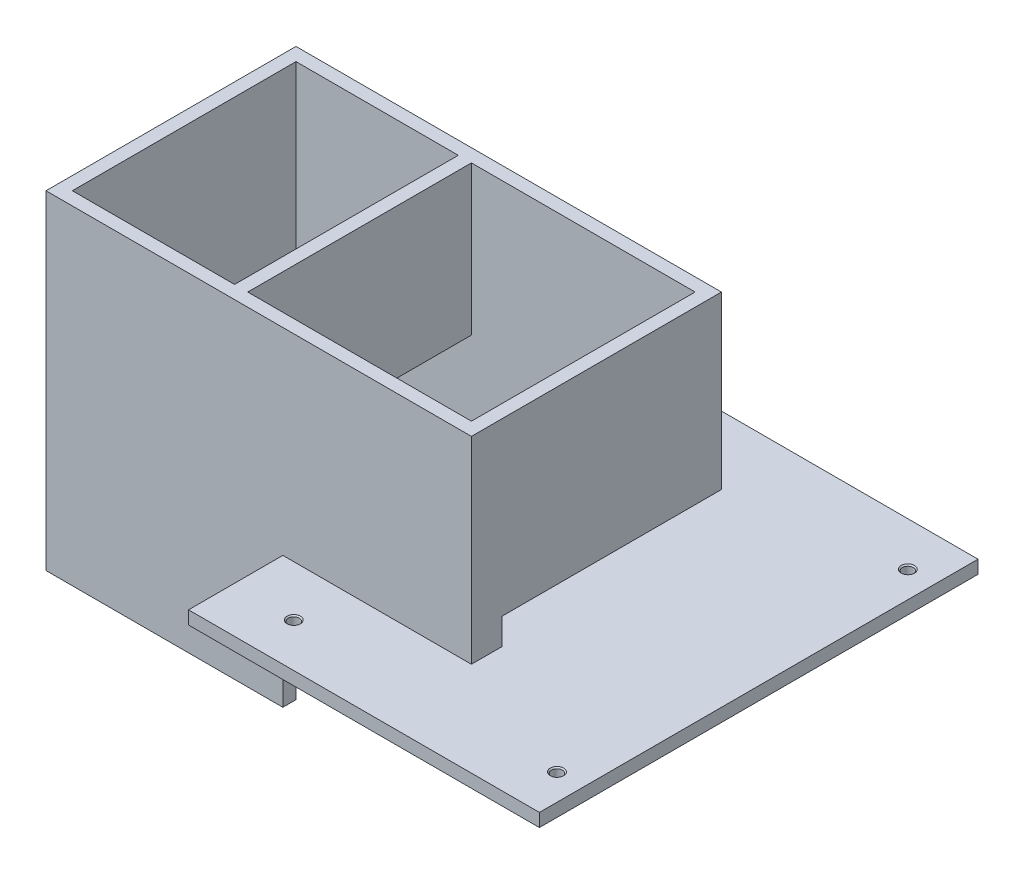
ISO-10303-21;
HEADER;
FILE_DESCRIPTION(('STEP AP214'),'2;1');
FILE_NAME('part.step','',(''),(''),'','','');
FILE_SCHEMA(('AUTOMOTIVE_DESIGN { 1 0 10303 214 1 1 1 1 }'));
ENDSEC;
DATA;
#1=APPLICATION_CONTEXT('core data for automotive mechanical design processes');
#2=APPLICATION_PROTOCOL_DEFINITION('international standard','automotive_design',2000,#1);
#3=PRODUCT_CONTEXT('',#1,'mechanical');
#4=PRODUCT('Part','Part','',(#3));
#5=PRODUCT_RELATED_PRODUCT_CATEGORY('part','',(#4));
#6=PRODUCT_DEFINITION_FORMATION('','',#4);
#7=PRODUCT_DEFINITION_CONTEXT('part definition',#1,'design');
#8=PRODUCT_DEFINITION('design','',#6,#7);
#9=PRODUCT_DEFINITION_SHAPE('','',#8);
#10=(LENGTH_UNIT() NAMED_UNIT(*) SI_UNIT(.MILLI.,.METRE.));
#11=(NAMED_UNIT(*) PLANE_ANGLE_UNIT() SI_UNIT($,.RADIAN.));
#12=(NAMED_UNIT(*) SI_UNIT($,.STERADIAN.) SOLID_ANGLE_UNIT());
#13=UNCERTAINTY_MEASURE_WITH_UNIT(LENGTH_MEASURE(1.E-05),#10,'distance_accuracy_value','');
#14=(GEOMETRIC_REPRESENTATION_CONTEXT(3) GLOBAL_UNCERTAINTY_ASSIGNED_CONTEXT((#13)) GLOBAL_UNIT_ASSIGNED_CONTEXT((#10,
#11,#12)) REPRESENTATION_CONTEXT('',''));
#15=CARTESIAN_POINT('',(0.,0.,0.));
#16=DIRECTION('',(0.,0.,1.));
#17=DIRECTION('',(1.,0.,0.));
#18=AXIS2_PLACEMENT_3D('',#15,#16,#17);
#19=CARTESIAN_POINT('',(-60.7657345094222,3.,-28.3375572312174));
#20=DIRECTION('',(1.,0.,0.));
#21=DIRECTION('',(0.,0.,-1.));
#22=AXIS2_PLACEMENT_3D('',#19,#20,#21);
#23=PLANE('',#22);
#24=DIRECTION('',(0.,0.,-1.));
#25=VECTOR('',#24,1.);
#26=CARTESIAN_POINT('',(-60.7657345094222,0.,50.1624427687826));
#27=LINE('',#26,#25);
#28=CARTESIAN_POINT('',(-60.7657345094222,0.,47.1624427687826));
#29=VERTEX_POINT('',#28);
#30=CARTESIAN_POINT('',(-60.7657345094222,0.,-3.83755723121743));
#31=VERTEX_POINT('',#30);
#32=EDGE_CURVE('E226',#29,#31,#27,.T.);
#33=ORIENTED_EDGE('',*,*,#32,.F.);
#34=DIRECTION('',(0.,1.,0.));
#35=VECTOR('',#34,1.);
#36=CARTESIAN_POINT('',(-60.7657345094222,-27.,47.1624427687826));
#37=LINE('',#36,#35);
#38=CARTESIAN_POINT('',(-60.7657345094222,3.,47.1624427687826));
#39=VERTEX_POINT('',#38);
#40=EDGE_CURVE('E342',#29,#39,#37,.T.);
#41=ORIENTED_EDGE('',*,*,#40,.T.);
#42=DIRECTION('',(0.,0.,1.));
#43=VECTOR('',#42,1.);
#44=CARTESIAN_POINT('',(-60.7657345094222,3.,-28.3375572312174));
#45=LINE('',#44,#43);
#46=CARTESIAN_POINT('',(-60.7657345094222,3.,-3.83755723121744));
#47=VERTEX_POINT('',#46);
#48=EDGE_CURVE('E514',#47,#39,#45,.T.);
#49=ORIENTED_EDGE('',*,*,#48,.F.);
#50=DIRECTION('',(0.,1.,0.));
#51=VECTOR('',#50,1.);
#52=CARTESIAN_POINT('',(-60.7657345094222,-27.,-3.83755723121744));
#53=LINE('',#52,#51);
#54=EDGE_CURVE('E346',#31,#47,#53,.T.);
#55=ORIENTED_EDGE('',*,*,#54,.F.);
#56=EDGE_LOOP('',(#33,#41,#49,#55));
#57=FACE_BOUND('',#56,.T.);
#58=ADVANCED_FACE('F40',(#57),#23,.F.);
#59=DIRECTION('',(0.,1.,0.));
#60=VECTOR('',#59,1.);
#61=CARTESIAN_POINT('',(-60.7657345094222,3.,50.1624427687826));
#62=LINE('',#61,#60);
#63=CARTESIAN_POINT('',(-60.7657345094222,0.,50.1624427687826));
#64=VERTEX_POINT('',#63);
#65=CARTESIAN_POINT('',(-60.7657345094223,3.,50.1624427687826));
#66=VERTEX_POINT('',#65);
#67=EDGE_CURVE('E255',#64,#66,#62,.T.);
#68=ORIENTED_EDGE('',*,*,#67,.F.);
#69=DIRECTION('',(0.,0.,1.));
#70=VECTOR('',#69,1.);
#71=CARTESIAN_POINT('',(-60.7657345094222,0.,-28.3375572312174));
#72=LINE('',#71,#70);
#73=CARTESIAN_POINT('',(-60.7657345094222,0.,71.6624427687826));
#74=VERTEX_POINT('',#73);
#75=EDGE_CURVE('E262',#64,#74,#72,.T.);
#76=ORIENTED_EDGE('',*,*,#75,.T.);
#77=DIRECTION('',(0.,-1.,0.));
#78=VECTOR('',#77,1.);
#79=CARTESIAN_POINT('',(-60.7657345094222,3.,71.6624427687826));
#80=LINE('',#79,#78);
#81=CARTESIAN_POINT('',(-60.7657345094222,3.,71.6624427687826));
#82=VERTEX_POINT('',#81);
#83=EDGE_CURVE('E276',#82,#74,#80,.T.);
#84=ORIENTED_EDGE('',*,*,#83,.F.);
#85=EDGE_CURVE('E511',#66,#82,#45,.T.);
#86=ORIENTED_EDGE('',*,*,#85,.F.);
#87=EDGE_LOOP('',(#68,#76,#84,#86));
#88=FACE_BOUND('',#87,.T.);
#89=ADVANCED_FACE('F531',(#88),#23,.F.);
#90=DIRECTION('',(0.,-1.,0.));
#91=VECTOR('',#90,1.);
#92=CARTESIAN_POINT('',(-60.7657345094222,3.,-6.83755723121744));
#93=LINE('',#92,#91);
#94=CARTESIAN_POINT('',(-60.7657345094223,3.,-6.83755723121744));
#95=VERTEX_POINT('',#94);
#96=CARTESIAN_POINT('',(-60.7657345094222,0.,-6.83755723121744));
#97=VERTEX_POINT('',#96);
#98=EDGE_CURVE('E246',#95,#97,#93,.T.);
#99=ORIENTED_EDGE('',*,*,#98,.F.);
#100=CARTESIAN_POINT('',(-60.7657345094222,3.,-28.3375572312174));
#101=VERTEX_POINT('',#100);
#102=EDGE_CURVE('E286',#101,#95,#45,.T.);
#103=ORIENTED_EDGE('',*,*,#102,.F.);
#104=DIRECTION('',(0.,-1.,0.));
#105=VECTOR('',#104,1.);
#106=CARTESIAN_POINT('',(-60.7657345094222,3.,-28.3375572312174));
#107=LINE('',#106,#105);
#108=CARTESIAN_POINT('',(-60.7657345094222,0.,-28.3375572312174));
#109=VERTEX_POINT('',#108);
#110=EDGE_CURVE('E259',#101,#109,#107,.T.);
#111=ORIENTED_EDGE('',*,*,#110,.T.);
#112=EDGE_CURVE('E222',#109,#97,#72,.T.);
#113=ORIENTED_EDGE('',*,*,#112,.T.);
#114=EDGE_LOOP('',(#99,#103,#111,#113));
#115=FACE_BOUND('',#114,.T.);
#116=ADVANCED_FACE('F258',(#115),#23,.F.);
#117=CARTESIAN_POINT('',(0.,0.,0.));
#118=DIRECTION('',(0.,-1.,0.));
#119=DIRECTION('',(0.,0.,-1.));
#120=AXIS2_PLACEMENT_3D('',#117,#118,#119);
#121=PLANE('',#120);
#122=EDGE_CURVE('E216',#31,#97,#27,.T.);
#123=ORIENTED_EDGE('',*,*,#122,.T.);
#124=ORIENTED_EDGE('',*,*,#112,.F.);
#125=DIRECTION('',(1.,0.,0.));
#126=VECTOR('',#125,1.);
#127=CARTESIAN_POINT('',(-60.7657345094222,0.,-28.3375572312174));
#128=LINE('',#127,#126);
#129=CARTESIAN_POINT('',(19.2342654905778,0.,-28.3375572312174));
#130=VERTEX_POINT('',#129);
#131=EDGE_CURVE('E503',#109,#130,#128,.T.);
#132=ORIENTED_EDGE('',*,*,#131,.T.);
#133=DIRECTION('',(0.,0.,1.));
#134=VECTOR('',#133,1.);
#135=CARTESIAN_POINT('',(19.2342654905778,0.,-28.3375572312174));
#136=LINE('',#135,#134);
#137=CARTESIAN_POINT('',(19.2342654905778,0.,71.6624427687826));
#138=VERTEX_POINT('',#137);
#139=EDGE_CURVE('E516',#130,#138,#136,.T.);
#140=ORIENTED_EDGE('',*,*,#139,.T.);
#141=DIRECTION('',(1.,0.,0.));
#142=VECTOR('',#141,1.);
#143=CARTESIAN_POINT('',(-60.7657345094222,0.,71.6624427687826));
#144=LINE('',#143,#142);
#145=EDGE_CURVE('E269',#74,#138,#144,.T.);
#146=ORIENTED_EDGE('',*,*,#145,.F.);
#147=ORIENTED_EDGE('',*,*,#75,.F.);
#148=EDGE_CURVE('E232',#64,#29,#27,.T.);
#149=ORIENTED_EDGE('',*,*,#148,.T.);
#150=ORIENTED_EDGE('',*,*,#32,.T.);
#151=EDGE_LOOP('',(#123,#124,#132,#140,#146,#147,#149,#150));
#152=FACE_BOUND('',#151,.T.);
#153=CARTESIAN_POINT('',(-46.7657345094222,0.,-18.3375572312174));
#154=DIRECTION('',(0.,-1.,0.));
#155=DIRECTION('',(0.,0.,-1.));
#156=AXIS2_PLACEMENT_3D('',#153,#154,#155);
#157=CIRCLE('',#156,1.24999999999999);
#158=CARTESIAN_POINT('',(-46.7657345094222,0.,-19.5875572312174));
#159=VERTEX_POINT('',#158);
#160=EDGE_CURVE('E44',#159,#159,#157,.T.);
#161=ORIENTED_EDGE('',*,*,#160,.F.);
#162=EDGE_LOOP('',(#161));
#163=FACE_BOUND('',#162,.T.);
#164=CARTESIAN_POINT('',(13.2342654905778,0.,-18.3375572312174));
#165=DIRECTION('',(0.,-1.,0.));
#166=DIRECTION('',(0.,0.,-1.));
#167=AXIS2_PLACEMENT_3D('',#164,#165,#166);
#168=CIRCLE('',#167,1.25);
#169=CARTESIAN_POINT('',(13.2342654905778,0.,-19.5875572312174));
#170=VERTEX_POINT('',#169);
#171=EDGE_CURVE('E301',#170,#170,#168,.T.);
#172=ORIENTED_EDGE('',*,*,#171,.F.);
#173=EDGE_LOOP('',(#172));
#174=FACE_BOUND('',#173,.T.);
#175=CARTESIAN_POINT('',(13.2342654905778,0.,61.6624427687825));
#176=DIRECTION('',(0.,-1.,0.));
#177=DIRECTION('',(0.,0.,-1.));
#178=AXIS2_PLACEMENT_3D('',#175,#176,#177);
#179=CIRCLE('',#178,1.25);
#180=CARTESIAN_POINT('',(13.2342654905778,0.,60.4124427687826));
#181=VERTEX_POINT('',#180);
#182=EDGE_CURVE('E296',#181,#181,#179,.T.);
#183=ORIENTED_EDGE('',*,*,#182,.F.);
#184=EDGE_LOOP('',(#183));
#185=FACE_BOUND('',#184,.T.);
#186=CARTESIAN_POINT('',(-46.7657345094222,0.,61.6624427687825));
#187=DIRECTION('',(0.,-1.,0.));
#188=DIRECTION('',(0.,0.,-1.));
#189=AXIS2_PLACEMENT_3D('',#186,#187,#188);
#190=CIRCLE('',#189,1.24999999999999);
#191=CARTESIAN_POINT('',(-46.7657345094222,0.,60.4124427687826));
#192=VERTEX_POINT('',#191);
#193=EDGE_CURVE('E290',#192,#192,#190,.T.);
#194=ORIENTED_EDGE('',*,*,#193,.F.);
#195=EDGE_LOOP('',(#194));
#196=FACE_BOUND('',#195,.T.);
#197=ADVANCED_FACE('F218',(#152,#163,#174,#185,#196),#121,.T.);
#198=CARTESIAN_POINT('',(-111.765734509422,48.,47.1624427687826));
#199=DIRECTION('',(0.,0.,-1.));
#200=DIRECTION('',(-1.,0.,0.));
#201=AXIS2_PLACEMENT_3D('',#198,#199,#200);
#202=PLANE('',#201);
#203=DIRECTION('',(1.,0.,0.));
#204=VECTOR('',#203,1.);
#205=CARTESIAN_POINT('',(-111.765734509422,48.,47.1624427687826));
#206=LINE('',#205,#204);
#207=CARTESIAN_POINT('',(-111.765734509422,48.,47.1624427687826));
#208=VERTEX_POINT('',#207);
#209=CARTESIAN_POINT('',(-74.7657345094222,48.,47.1624427687826));
#210=VERTEX_POINT('',#209);
#211=EDGE_CURVE('E433',#208,#210,#206,.T.);
#212=ORIENTED_EDGE('',*,*,#211,.T.);
#213=DIRECTION('',(0.,-1.,0.));
#214=VECTOR('',#213,1.);
#215=CARTESIAN_POINT('',(-74.7657345094222,48.,47.1624427687826));
#216=LINE('',#215,#214);
#217=CARTESIAN_POINT('',(-74.7657345094222,14.,47.1624427687826));
#218=VERTEX_POINT('',#217);
#219=EDGE_CURVE('E392',#210,#218,#216,.T.);
#220=ORIENTED_EDGE('',*,*,#219,.T.);
#221=DIRECTION('',(1.,0.,0.));
#222=VECTOR('',#221,1.);
#223=CARTESIAN_POINT('',(-74.7657345094222,14.,47.1624427687826));
#224=LINE('',#223,#222);
#225=CARTESIAN_POINT('',(-71.7657345094222,14.,47.1624427687826));
#226=VERTEX_POINT('',#225);
#227=EDGE_CURVE('E396',#218,#226,#224,.T.);
#228=ORIENTED_EDGE('',*,*,#227,.T.);
#229=DIRECTION('',(0.,1.,0.));
#230=VECTOR('',#229,1.);
#231=CARTESIAN_POINT('',(-71.7657345094222,14.,47.1624427687826));
#232=LINE('',#231,#230);
#233=CARTESIAN_POINT('',(-71.7657345094222,48.,47.1624427687826));
#234=VERTEX_POINT('',#233);
#235=EDGE_CURVE('E401',#226,#234,#232,.T.);
#236=ORIENTED_EDGE('',*,*,#235,.T.);
#237=CARTESIAN_POINT('',(-20.7657345094222,48.,47.1624427687826));
#238=VERTEX_POINT('',#237);
#239=EDGE_CURVE('E431',#234,#238,#206,.T.);
#240=ORIENTED_EDGE('',*,*,#239,.T.);
#241=DIRECTION('',(0.,-1.,0.));
#242=VECTOR('',#241,1.);
#243=CARTESIAN_POINT('',(-20.7657345094222,48.,47.1624427687826));
#244=LINE('',#243,#242);
#245=CARTESIAN_POINT('',(-20.7657345094222,3.,47.1624427687826));
#246=VERTEX_POINT('',#245);
#247=EDGE_CURVE('E461',#238,#246,#244,.T.);
#248=ORIENTED_EDGE('',*,*,#247,.T.);
#249=DIRECTION('',(1.,0.,0.));
#250=VECTOR('',#249,1.);
#251=CARTESIAN_POINT('',(-111.765734509422,3.,47.1624427687826));
#252=LINE('',#251,#250);
#253=EDGE_CURVE('E275',#39,#246,#252,.T.);
#254=ORIENTED_EDGE('',*,*,#253,.F.);
#255=ORIENTED_EDGE('',*,*,#40,.F.);
#256=CARTESIAN_POINT('',(-60.7657345094222,-27.,47.1624427687826));
#257=VERTEX_POINT('',#256);
#258=EDGE_CURVE('E343',#257,#29,#37,.T.);
#259=ORIENTED_EDGE('',*,*,#258,.F.);
#260=DIRECTION('',(-1.,0.,0.));
#261=VECTOR('',#260,1.);
#262=CARTESIAN_POINT('',(-60.7657345094222,-27.,47.1624427687826));
#263=LINE('',#262,#261);
#264=CARTESIAN_POINT('',(-111.765734509422,-27.,47.1624427687826));
#265=VERTEX_POINT('',#264);
#266=EDGE_CURVE('E294',#257,#265,#263,.T.);
#267=ORIENTED_EDGE('',*,*,#266,.T.);
#268=DIRECTION('',(0.,-1.,0.));
#269=VECTOR('',#268,1.);
#270=CARTESIAN_POINT('',(-111.765734509422,48.,47.1624427687826));
#271=LINE('',#270,#269);
#272=EDGE_CURVE('E465',#208,#265,#271,.T.);
#273=ORIENTED_EDGE('',*,*,#272,.F.);
#274=EDGE_LOOP('',(#212,#220,#228,#236,#240,#248,#254,#255,#259,#267,#273));
#275=FACE_BOUND('',#274,.T.);
#276=ADVANCED_FACE('F580',(#275),#202,.T.);
#277=CARTESIAN_POINT('',(-111.765734509422,48.,-3.83755723121744));
#278=DIRECTION('',(0.,0.,1.));
#279=DIRECTION('',(1.,0.,0.));
#280=AXIS2_PLACEMENT_3D('',#277,#278,#279);
#281=PLANE('',#280);
#282=DIRECTION('',(-1.,0.,0.));
#283=VECTOR('',#282,1.);
#284=CARTESIAN_POINT('',(-111.765734509422,9.00000000000002,-3.83755723121744));
#285=LINE('',#284,#283);
#286=CARTESIAN_POINT('',(-20.7657345094222,9.00000000000001,-3.83755723121744));
#287=VERTEX_POINT('',#286);
#288=CARTESIAN_POINT('',(-47.7657345094222,9.00000000000001,-3.83755723121744));
#289=VERTEX_POINT('',#288);
#290=EDGE_CURVE('E380',#287,#289,#285,.T.);
#291=ORIENTED_EDGE('',*,*,#290,.F.);
#292=DIRECTION('',(0.,-1.,0.));
#293=VECTOR('',#292,1.);
#294=CARTESIAN_POINT('',(-20.7657345094222,48.,-3.83755723121744));
#295=LINE('',#294,#293);
#296=CARTESIAN_POINT('',(-20.7657345094222,48.,-3.83755723121744));
#297=VERTEX_POINT('',#296);
#298=EDGE_CURVE('E457',#297,#287,#295,.T.);
#299=ORIENTED_EDGE('',*,*,#298,.F.);
#300=DIRECTION('',(-1.,0.,0.));
#301=VECTOR('',#300,1.);
#302=CARTESIAN_POINT('',(-111.765734509422,48.,-3.83755723121744));
#303=LINE('',#302,#301);
#304=CARTESIAN_POINT('',(-71.7657345094222,48.,-3.83755723121744));
#305=VERTEX_POINT('',#304);
#306=EDGE_CURVE('E442',#297,#305,#303,.T.);
#307=ORIENTED_EDGE('',*,*,#306,.T.);
#308=DIRECTION('',(0.,1.,0.));
#309=VECTOR('',#308,1.);
#310=CARTESIAN_POINT('',(-71.7657345094222,14.,-3.83755723121744));
#311=LINE('',#310,#309);
#312=CARTESIAN_POINT('',(-71.7657345094222,14.,-3.83755723121744));
#313=VERTEX_POINT('',#312);
#314=EDGE_CURVE('E397',#313,#305,#311,.T.);
#315=ORIENTED_EDGE('',*,*,#314,.F.);
#316=DIRECTION('',(1.,0.,0.));
#317=VECTOR('',#316,1.);
#318=CARTESIAN_POINT('',(-74.7657345094222,14.,-3.83755723121744));
#319=LINE('',#318,#317);
#320=CARTESIAN_POINT('',(-74.7657345094222,14.,-3.83755723121744));
#321=VERTEX_POINT('',#320);
#322=EDGE_CURVE('E408',#321,#313,#319,.T.);
#323=ORIENTED_EDGE('',*,*,#322,.F.);
#324=DIRECTION('',(0.,-1.,0.));
#325=VECTOR('',#324,1.);
#326=CARTESIAN_POINT('',(-74.7657345094222,48.,-3.83755723121744));
#327=LINE('',#326,#325);
#328=CARTESIAN_POINT('',(-74.7657345094222,48.,-3.83755723121744));
#329=VERTEX_POINT('',#328);
#330=EDGE_CURVE('E391',#329,#321,#327,.T.);
#331=ORIENTED_EDGE('',*,*,#330,.F.);
#332=CARTESIAN_POINT('',(-111.765734509422,48.,-3.83755723121744));
#333=VERTEX_POINT('',#332);
#334=EDGE_CURVE('E441',#329,#333,#303,.T.);
#335=ORIENTED_EDGE('',*,*,#334,.T.);
#336=DIRECTION('',(0.,-1.,0.));
#337=VECTOR('',#336,1.);
#338=CARTESIAN_POINT('',(-111.765734509422,48.,-3.83755723121744));
#339=LINE('',#338,#337);
#340=CARTESIAN_POINT('',(-111.765734509422,-27.,-3.83755723121744));
#341=VERTEX_POINT('',#340);
#342=EDGE_CURVE('E446',#333,#341,#339,.T.);
#343=ORIENTED_EDGE('',*,*,#342,.T.);
#344=DIRECTION('',(1.,0.,0.));
#345=VECTOR('',#344,1.);
#346=CARTESIAN_POINT('',(-111.765734509422,-27.,-3.83755723121744));
#347=LINE('',#346,#345);
#348=CARTESIAN_POINT('',(-60.7657345094222,-27.,-3.83755723121743));
#349=VERTEX_POINT('',#348);
#350=EDGE_CURVE('E338',#341,#349,#347,.T.);
#351=ORIENTED_EDGE('',*,*,#350,.T.);
#352=EDGE_CURVE('E347',#349,#31,#53,.T.);
#353=ORIENTED_EDGE('',*,*,#352,.T.);
#354=ORIENTED_EDGE('',*,*,#54,.T.);
#355=DIRECTION('',(-1.,0.,0.));
#356=VECTOR('',#355,1.);
#357=CARTESIAN_POINT('',(-111.765734509422,3.,-3.83755723121744));
#358=LINE('',#357,#356);
#359=CARTESIAN_POINT('',(-47.7657345094222,3.,-3.83755723121744));
#360=VERTEX_POINT('',#359);
#361=EDGE_CURVE('E432',#360,#47,#358,.T.);
#362=ORIENTED_EDGE('',*,*,#361,.F.);
#363=DIRECTION('',(0.,-1.,0.));
#364=VECTOR('',#363,1.);
#365=CARTESIAN_POINT('',(-47.7657345094222,48.,-3.83755723121744));
#366=LINE('',#365,#364);
#367=EDGE_CURVE('E388',#289,#360,#366,.T.);
#368=ORIENTED_EDGE('',*,*,#367,.F.);
#369=EDGE_LOOP('',(#291,#299,#307,#315,#323,#331,#335,#343,#351,#353,#354,#362,#368));
#370=FACE_BOUND('',#369,.T.);
#371=ADVANCED_FACE('F572',(#370),#281,.T.);
#372=CARTESIAN_POINT('',(-60.7657345094222,3.,-28.3375572312174));
#373=DIRECTION('',(0.,0.,-1.));
#374=DIRECTION('',(-1.,0.,0.));
#375=AXIS2_PLACEMENT_3D('',#372,#373,#374);
#376=PLANE('',#375);
#377=ORIENTED_EDGE('',*,*,#131,.F.);
#378=ORIENTED_EDGE('',*,*,#110,.F.);
#379=DIRECTION('',(1.,0.,0.));
#380=VECTOR('',#379,1.);
#381=CARTESIAN_POINT('',(-60.7657345094222,3.,-28.3375572312174));
#382=LINE('',#381,#380);
#383=CARTESIAN_POINT('',(19.2342654905778,3.,-28.3375572312174));
#384=VERTEX_POINT('',#383);
#385=EDGE_CURVE('E261',#101,#384,#382,.T.);
#386=ORIENTED_EDGE('',*,*,#385,.T.);
#387=DIRECTION('',(0.,-1.,0.));
#388=VECTOR('',#387,1.);
#389=CARTESIAN_POINT('',(19.2342654905778,3.,-28.3375572312174));
#390=LINE('',#389,#388);
#391=EDGE_CURVE('E283',#384,#130,#390,.T.);
#392=ORIENTED_EDGE('',*,*,#391,.T.);
#393=EDGE_LOOP('',(#377,#378,#386,#392));
#394=FACE_BOUND('',#393,.T.);
#395=ADVANCED_FACE('F42',(#394),#376,.T.);
#396=CARTESIAN_POINT('',(-60.7657345094222,3.,71.6624427687826));
#397=DIRECTION('',(0.,0.,-1.));
#398=DIRECTION('',(-1.,0.,0.));
#399=AXIS2_PLACEMENT_3D('',#396,#397,#398);
#400=PLANE('',#399);
#401=ORIENTED_EDGE('',*,*,#145,.T.);
#402=DIRECTION('',(0.,-1.,0.));
#403=VECTOR('',#402,1.);
#404=CARTESIAN_POINT('',(19.2342654905778,3.,71.6624427687826));
#405=LINE('',#404,#403);
#406=CARTESIAN_POINT('',(19.2342654905778,3.,71.6624427687826));
#407=VERTEX_POINT('',#406);
#408=EDGE_CURVE('E280',#407,#138,#405,.T.);
#409=ORIENTED_EDGE('',*,*,#408,.F.);
#410=DIRECTION('',(1.,0.,0.));
#411=VECTOR('',#410,1.);
#412=CARTESIAN_POINT('',(-60.7657345094222,3.,71.6624427687826));
#413=LINE('',#412,#411);
#414=EDGE_CURVE('E508',#82,#407,#413,.T.);
#415=ORIENTED_EDGE('',*,*,#414,.F.);
#416=ORIENTED_EDGE('',*,*,#83,.T.);
#417=EDGE_LOOP('',(#401,#409,#415,#416));
#418=FACE_BOUND('',#417,.T.);
#419=ADVANCED_FACE('F525',(#418),#400,.F.);
#420=CARTESIAN_POINT('',(19.2342654905778,3.,-28.3375572312174));
#421=DIRECTION('',(1.,0.,0.));
#422=DIRECTION('',(0.,0.,-1.));
#423=AXIS2_PLACEMENT_3D('',#420,#421,#422);
#424=PLANE('',#423);
#425=ORIENTED_EDGE('',*,*,#139,.F.);
#426=ORIENTED_EDGE('',*,*,#391,.F.);
#427=DIRECTION('',(0.,0.,1.));
#428=VECTOR('',#427,1.);
#429=CARTESIAN_POINT('',(19.2342654905778,3.,-28.3375572312174));
#430=LINE('',#429,#428);
#431=EDGE_CURVE('E267',#384,#407,#430,.T.);
#432=ORIENTED_EDGE('',*,*,#431,.T.);
#433=ORIENTED_EDGE('',*,*,#408,.T.);
#434=EDGE_LOOP('',(#425,#426,#432,#433));
#435=FACE_BOUND('',#434,.T.);
#436=ADVANCED_FACE('F658',(#435),#424,.T.);
#437=CARTESIAN_POINT('',(0.,3.,0.));
#438=DIRECTION('',(0.,-1.,0.));
#439=DIRECTION('',(0.,0.,-1.));
#440=AXIS2_PLACEMENT_3D('',#437,#438,#439);
#441=PLANE('',#440);
#442=CARTESIAN_POINT('',(-46.7657345094222,3.,-18.3375572312174));
#443=DIRECTION('',(0.,1.,0.));
#444=DIRECTION('',(0.,0.,1.));
#445=AXIS2_PLACEMENT_3D('',#442,#443,#444);
#446=CIRCLE('',#445,1.525);
#447=CARTESIAN_POINT('',(-46.7657345094222,3.,-16.8125572312174));
#448=VERTEX_POINT('',#447);
#449=EDGE_CURVE('E622',#448,#448,#446,.T.);
#450=ORIENTED_EDGE('',*,*,#449,.F.);
#451=EDGE_LOOP('',(#450));
#452=FACE_BOUND('',#451,.T.);
#453=CARTESIAN_POINT('',(13.2342654905778,3.,-18.3375572312174));
#454=DIRECTION('',(0.,1.,0.));
#455=DIRECTION('',(0.,0.,1.));
#456=AXIS2_PLACEMENT_3D('',#453,#454,#455);
#457=CIRCLE('',#456,1.525);
#458=CARTESIAN_POINT('',(13.2342654905778,3.,-16.8125572312174));
#459=VERTEX_POINT('',#458);
#460=EDGE_CURVE('E313',#459,#459,#457,.T.);
#461=ORIENTED_EDGE('',*,*,#460,.F.);
#462=EDGE_LOOP('',(#461));
#463=FACE_BOUND('',#462,.T.);
#464=CARTESIAN_POINT('',(13.2342654905778,3.,61.6624427687825));
#465=DIRECTION('',(0.,1.,0.));
#466=DIRECTION('',(0.,0.,1.));
#467=AXIS2_PLACEMENT_3D('',#464,#465,#466);
#468=CIRCLE('',#467,1.525);
#469=CARTESIAN_POINT('',(13.2342654905778,3.,63.1874427687825));
#470=VERTEX_POINT('',#469);
#471=EDGE_CURVE('E304',#470,#470,#468,.T.);
#472=ORIENTED_EDGE('',*,*,#471,.F.);
#473=EDGE_LOOP('',(#472));
#474=FACE_BOUND('',#473,.T.);
#475=CARTESIAN_POINT('',(-46.7657345094222,3.,61.6624427687825));
#476=DIRECTION('',(0.,1.,0.));
#477=DIRECTION('',(0.,0.,1.));
#478=AXIS2_PLACEMENT_3D('',#475,#476,#477);
#479=CIRCLE('',#478,1.525);
#480=CARTESIAN_POINT('',(-46.7657345094222,3.,63.1874427687825));
#481=VERTEX_POINT('',#480);
#482=EDGE_CURVE('E299',#481,#481,#479,.T.);
#483=ORIENTED_EDGE('',*,*,#482,.F.);
#484=EDGE_LOOP('',(#483));
#485=FACE_BOUND('',#484,.T.);
#486=ORIENTED_EDGE('',*,*,#253,.T.);
#487=DIRECTION('',(0.,0.,-1.));
#488=VECTOR('',#487,1.);
#489=CARTESIAN_POINT('',(-20.7657345094222,3.,-3.83755723121744));
#490=LINE('',#489,#488);
#491=CARTESIAN_POINT('',(-20.7657345094222,3.,43.1624427687826));
#492=VERTEX_POINT('',#491);
#493=EDGE_CURVE('E427',#246,#492,#490,.T.);
#494=ORIENTED_EDGE('',*,*,#493,.T.);
#495=DIRECTION('',(-1.,0.,0.));
#496=VECTOR('',#495,1.);
#497=CARTESIAN_POINT('',(-17.7657345094222,3.,43.1624427687826));
#498=LINE('',#497,#496);
#499=CARTESIAN_POINT('',(-17.7657345094222,3.,43.1624427687826));
#500=VERTEX_POINT('',#499);
#501=EDGE_CURVE('E66',#500,#492,#498,.T.);
#502=ORIENTED_EDGE('',*,*,#501,.F.);
#503=DIRECTION('',(0.,0.,-1.));
#504=VECTOR('',#503,1.);
#505=CARTESIAN_POINT('',(-17.7657345094222,3.,-6.83755723121744));
#506=LINE('',#505,#504);
#507=CARTESIAN_POINT('',(-17.7657345094222,3.,50.1624427687826));
#508=VERTEX_POINT('',#507);
#509=EDGE_CURVE('E473',#508,#500,#506,.T.);
#510=ORIENTED_EDGE('',*,*,#509,.F.);
#511=DIRECTION('',(1.,0.,0.));
#512=VECTOR('',#511,1.);
#513=CARTESIAN_POINT('',(-114.765734509422,3.,50.1624427687826));
#514=LINE('',#513,#512);
#515=EDGE_CURVE('E288',#66,#508,#514,.T.);
#516=ORIENTED_EDGE('',*,*,#515,.F.);
#517=ORIENTED_EDGE('',*,*,#85,.T.);
#518=ORIENTED_EDGE('',*,*,#414,.T.);
#519=ORIENTED_EDGE('',*,*,#431,.F.);
#520=ORIENTED_EDGE('',*,*,#385,.F.);
#521=ORIENTED_EDGE('',*,*,#102,.T.);
#522=DIRECTION('',(-1.,0.,0.));
#523=VECTOR('',#522,1.);
#524=CARTESIAN_POINT('',(-114.765734509422,3.,-6.83755723121744));
#525=LINE('',#524,#523);
#526=CARTESIAN_POINT('',(-47.7657345094222,3.,-6.83755723121744));
#527=VERTEX_POINT('',#526);
#528=EDGE_CURVE('E250',#527,#95,#525,.T.);
#529=ORIENTED_EDGE('',*,*,#528,.F.);
#530=DIRECTION('',(0.,0.,-1.));
#531=VECTOR('',#530,1.);
#532=CARTESIAN_POINT('',(-47.7657345094222,3.,43.1624427687826));
#533=LINE('',#532,#531);
#534=EDGE_CURVE('E372',#360,#527,#533,.T.);
#535=ORIENTED_EDGE('',*,*,#534,.F.);
#536=ORIENTED_EDGE('',*,*,#361,.T.);
#537=ORIENTED_EDGE('',*,*,#48,.T.);
#538=EDGE_LOOP('',(#486,#494,#502,#510,#516,#517,#518,#519,#520,#521,#529,#535,#536,#537));
#539=FACE_BOUND('',#538,.T.);
#540=ADVANCED_FACE('F541',(#452,#463,#474,#485,#539),#441,.F.);
#541=CARTESIAN_POINT('',(0.,48.,0.));
#542=DIRECTION('',(0.,-1.,0.));
#543=DIRECTION('',(0.,0.,-1.));
#544=AXIS2_PLACEMENT_3D('',#541,#542,#543);
#545=PLANE('',#544);
#546=DIRECTION('',(0.,0.,-1.));
#547=VECTOR('',#546,1.);
#548=CARTESIAN_POINT('',(-74.7657345094222,48.,47.1624427687826));
#549=LINE('',#548,#547);
#550=EDGE_CURVE('E424',#210,#329,#549,.T.);
#551=ORIENTED_EDGE('',*,*,#550,.F.);
#552=ORIENTED_EDGE('',*,*,#211,.F.);
#553=DIRECTION('',(0.,0.,1.));
#554=VECTOR('',#553,1.);
#555=CARTESIAN_POINT('',(-111.765734509422,48.,-3.83755723121744));
#556=LINE('',#555,#554);
#557=EDGE_CURVE('E428',#333,#208,#556,.T.);
#558=ORIENTED_EDGE('',*,*,#557,.F.);
#559=ORIENTED_EDGE('',*,*,#334,.F.);
#560=EDGE_LOOP('',(#551,#552,#558,#559));
#561=FACE_BOUND('',#560,.T.);
#562=DIRECTION('',(-1.,0.,0.));
#563=VECTOR('',#562,1.);
#564=CARTESIAN_POINT('',(-114.765734509422,48.,-6.83755723121744));
#565=LINE('',#564,#563);
#566=CARTESIAN_POINT('',(-17.7657345094222,48.,-6.83755723121744));
#567=VERTEX_POINT('',#566);
#568=CARTESIAN_POINT('',(-114.765734509422,48.,-6.83755723121744));
#569=VERTEX_POINT('',#568);
#570=EDGE_CURVE('E468',#567,#569,#565,.T.);
#571=ORIENTED_EDGE('',*,*,#570,.T.);
#572=DIRECTION('',(0.,0.,1.));
#573=VECTOR('',#572,1.);
#574=CARTESIAN_POINT('',(-114.765734509422,48.,-6.83755723121744));
#575=LINE('',#574,#573);
#576=CARTESIAN_POINT('',(-114.765734509422,48.,50.1624427687826));
#577=VERTEX_POINT('',#576);
#578=EDGE_CURVE('E472',#569,#577,#575,.T.);
#579=ORIENTED_EDGE('',*,*,#578,.T.);
#580=DIRECTION('',(1.,0.,0.));
#581=VECTOR('',#580,1.);
#582=CARTESIAN_POINT('',(-114.765734509422,48.,50.1624427687826));
#583=LINE('',#582,#581);
#584=CARTESIAN_POINT('',(-17.7657345094222,48.,50.1624427687826));
#585=VERTEX_POINT('',#584);
#586=EDGE_CURVE('E476',#577,#585,#583,.T.);
#587=ORIENTED_EDGE('',*,*,#586,.T.);
#588=DIRECTION('',(0.,0.,-1.));
#589=VECTOR('',#588,1.);
#590=CARTESIAN_POINT('',(-17.7657345094222,48.,-6.83755723121744));
#591=LINE('',#590,#589);
#592=EDGE_CURVE('E479',#585,#567,#591,.T.);
#593=ORIENTED_EDGE('',*,*,#592,.T.);
#594=EDGE_LOOP('',(#571,#579,#587,#593));
#595=FACE_BOUND('',#594,.T.);
#596=ORIENTED_EDGE('',*,*,#239,.F.);
#597=DIRECTION('',(0.,0.,-1.));
#598=VECTOR('',#597,1.);
#599=CARTESIAN_POINT('',(-71.7657345094222,48.,47.1624427687826));
#600=LINE('',#599,#598);
#601=EDGE_CURVE('E405',#234,#305,#600,.T.);
#602=ORIENTED_EDGE('',*,*,#601,.T.);
#603=ORIENTED_EDGE('',*,*,#306,.F.);
#604=DIRECTION('',(0.,0.,-1.));
#605=VECTOR('',#604,1.);
#606=CARTESIAN_POINT('',(-20.7657345094222,48.,-3.83755723121744));
#607=LINE('',#606,#605);
#608=EDGE_CURVE('E437',#238,#297,#607,.T.);
#609=ORIENTED_EDGE('',*,*,#608,.F.);
#610=EDGE_LOOP('',(#596,#602,#603,#609));
#611=FACE_BOUND('',#610,.T.);
#612=ADVANCED_FACE('F551',(#561,#595,#611),#545,.F.);
#613=CARTESIAN_POINT('',(-114.765734509422,48.,-6.83755723121744));
#614=DIRECTION('',(0.,0.,1.));
#615=DIRECTION('',(1.,0.,0.));
#616=AXIS2_PLACEMENT_3D('',#613,#614,#615);
#617=PLANE('',#616);
#618=ORIENTED_EDGE('',*,*,#98,.T.);
#619=DIRECTION('',(0.,-1.,0.));
#620=VECTOR('',#619,1.);
#621=CARTESIAN_POINT('',(-60.7657345094222,0.,-6.83755723121744));
#622=LINE('',#621,#620);
#623=CARTESIAN_POINT('',(-60.7657345094222,-27.,-6.83755723121744));
#624=VERTEX_POINT('',#623);
#625=EDGE_CURVE('E234',#97,#624,#622,.T.);
#626=ORIENTED_EDGE('',*,*,#625,.T.);
#627=DIRECTION('',(1.,0.,0.));
#628=VECTOR('',#627,1.);
#629=CARTESIAN_POINT('',(-114.765734509422,-27.,-6.83755723121744));
#630=LINE('',#629,#628);
#631=CARTESIAN_POINT('',(-114.765734509422,-27.,-6.83755723121744));
#632=VERTEX_POINT('',#631);
#633=EDGE_CURVE('E256',#632,#624,#630,.T.);
#634=ORIENTED_EDGE('',*,*,#633,.F.);
#635=DIRECTION('',(0.,-1.,0.));
#636=VECTOR('',#635,1.);
#637=CARTESIAN_POINT('',(-114.765734509422,48.,-6.83755723121744));
#638=LINE('',#637,#636);
#639=EDGE_CURVE('E501',#569,#632,#638,.T.);
#640=ORIENTED_EDGE('',*,*,#639,.F.);
#641=ORIENTED_EDGE('',*,*,#570,.F.);
#642=DIRECTION('',(0.,-1.,0.));
#643=VECTOR('',#642,1.);
#644=CARTESIAN_POINT('',(-17.7657345094222,48.,-6.83755723121744));
#645=LINE('',#644,#643);
#646=CARTESIAN_POINT('',(-17.7657345094222,9.,-6.83755723121744));
#647=VERTEX_POINT('',#646);
#648=EDGE_CURVE('E482',#567,#647,#645,.T.);
#649=ORIENTED_EDGE('',*,*,#648,.T.);
#650=DIRECTION('',(1.,0.,0.));
#651=VECTOR('',#650,1.);
#652=CARTESIAN_POINT('',(-47.7657345094222,9.00000000000001,-6.83755723121744));
#653=LINE('',#652,#651);
#654=CARTESIAN_POINT('',(-47.7657345094222,9.00000000000001,-6.83755723121744));
#655=VERTEX_POINT('',#654);
#656=EDGE_CURVE('E366',#655,#647,#653,.T.);
#657=ORIENTED_EDGE('',*,*,#656,.F.);
#658=DIRECTION('',(0.,1.,0.));
#659=VECTOR('',#658,1.);
#660=CARTESIAN_POINT('',(-47.7657345094222,3.,-6.83755723121744));
#661=LINE('',#660,#659);
#662=EDGE_CURVE('E362',#527,#655,#661,.T.);
#663=ORIENTED_EDGE('',*,*,#662,.F.);
#664=ORIENTED_EDGE('',*,*,#528,.T.);
#665=EDGE_LOOP('',(#618,#626,#634,#640,#641,#649,#657,#663,#664));
#666=FACE_BOUND('',#665,.T.);
#667=ADVANCED_FACE('F247',(#666),#617,.F.);
#668=CARTESIAN_POINT('',(-114.765734509422,48.,-6.83755723121744));
#669=DIRECTION('',(1.,0.,0.));
#670=DIRECTION('',(0.,0.,-1.));
#671=AXIS2_PLACEMENT_3D('',#668,#669,#670);
#672=PLANE('',#671);
#673=ORIENTED_EDGE('',*,*,#639,.T.);
#674=DIRECTION('',(0.,0.,-1.));
#675=VECTOR('',#674,1.);
#676=CARTESIAN_POINT('',(-114.765734509422,-27.,50.1624427687826));
#677=LINE('',#676,#675);
#678=CARTESIAN_POINT('',(-114.765734509422,-27.,50.1624427687826));
#679=VERTEX_POINT('',#678);
#680=EDGE_CURVE('E354',#679,#632,#677,.T.);
#681=ORIENTED_EDGE('',*,*,#680,.F.);
#682=DIRECTION('',(0.,-1.,0.));
#683=VECTOR('',#682,1.);
#684=CARTESIAN_POINT('',(-114.765734509422,48.,50.1624427687826));
#685=LINE('',#684,#683);
#686=EDGE_CURVE('E497',#577,#679,#685,.T.);
#687=ORIENTED_EDGE('',*,*,#686,.F.);
#688=ORIENTED_EDGE('',*,*,#578,.F.);
#689=EDGE_LOOP('',(#673,#681,#687,#688));
#690=FACE_BOUND('',#689,.T.);
#691=ADVANCED_FACE('F556',(#690),#672,.F.);
#692=CARTESIAN_POINT('',(-114.765734509422,48.,50.1624427687826));
#693=DIRECTION('',(0.,0.,-1.));
#694=DIRECTION('',(-1.,0.,0.));
#695=AXIS2_PLACEMENT_3D('',#692,#693,#694);
#696=PLANE('',#695);
#697=DIRECTION('',(-1.,0.,0.));
#698=VECTOR('',#697,1.);
#699=CARTESIAN_POINT('',(-57.7657345094222,-27.,50.1624427687826));
#700=LINE('',#699,#698);
#701=CARTESIAN_POINT('',(-60.7657345094222,-27.,50.1624427687826));
#702=VERTEX_POINT('',#701);
#703=EDGE_CURVE('E351',#702,#679,#700,.T.);
#704=ORIENTED_EDGE('',*,*,#703,.F.);
#705=DIRECTION('',(0.,-1.,0.));
#706=VECTOR('',#705,1.);
#707=CARTESIAN_POINT('',(-60.7657345094222,0.,50.1624427687826));
#708=LINE('',#707,#706);
#709=EDGE_CURVE('E243',#64,#702,#708,.T.);
#710=ORIENTED_EDGE('',*,*,#709,.F.);
#711=ORIENTED_EDGE('',*,*,#67,.T.);
#712=ORIENTED_EDGE('',*,*,#515,.T.);
#713=DIRECTION('',(0.,-1.,0.));
#714=VECTOR('',#713,1.);
#715=CARTESIAN_POINT('',(-17.7657345094222,48.,50.1624427687826));
#716=LINE('',#715,#714);
#717=EDGE_CURVE('E493',#585,#508,#716,.T.);
#718=ORIENTED_EDGE('',*,*,#717,.F.);
#719=ORIENTED_EDGE('',*,*,#586,.F.);
#720=ORIENTED_EDGE('',*,*,#686,.T.);
#721=EDGE_LOOP('',(#704,#710,#711,#712,#718,#719,#720));
#722=FACE_BOUND('',#721,.T.);
#723=ADVANCED_FACE('F537',(#722),#696,.F.);
#724=CARTESIAN_POINT('',(-17.7657345094222,48.,-6.83755723121744));
#725=DIRECTION('',(-1.,0.,0.));
#726=DIRECTION('',(0.,0.,1.));
#727=AXIS2_PLACEMENT_3D('',#724,#725,#726);
#728=PLANE('',#727);
#729=DIRECTION('',(0.,-1.,0.));
#730=VECTOR('',#729,1.);
#731=CARTESIAN_POINT('',(-17.7657345094222,9.,43.1624427687826));
#732=LINE('',#731,#730);
#733=CARTESIAN_POINT('',(-17.7657345094222,9.,43.1624427687826));
#734=VERTEX_POINT('',#733);
#735=EDGE_CURVE('E363',#734,#500,#732,.T.);
#736=ORIENTED_EDGE('',*,*,#735,.F.);
#737=DIRECTION('',(0.,0.,-1.));
#738=VECTOR('',#737,1.);
#739=CARTESIAN_POINT('',(-17.7657345094222,9.,43.1624427687826));
#740=LINE('',#739,#738);
#741=EDGE_CURVE('E58',#734,#647,#740,.T.);
#742=ORIENTED_EDGE('',*,*,#741,.T.);
#743=ORIENTED_EDGE('',*,*,#648,.F.);
#744=ORIENTED_EDGE('',*,*,#592,.F.);
#745=ORIENTED_EDGE('',*,*,#717,.T.);
#746=ORIENTED_EDGE('',*,*,#509,.T.);
#747=EDGE_LOOP('',(#736,#742,#743,#744,#745,#746));
#748=FACE_BOUND('',#747,.T.);
#749=ADVANCED_FACE('F544',(#748),#728,.F.);
#750=CARTESIAN_POINT('',(-111.765734509422,48.,-3.83755723121744));
#751=DIRECTION('',(1.,0.,0.));
#752=DIRECTION('',(0.,0.,-1.));
#753=AXIS2_PLACEMENT_3D('',#750,#751,#752);
#754=PLANE('',#753);
#755=ORIENTED_EDGE('',*,*,#272,.T.);
#756=DIRECTION('',(0.,0.,-1.));
#757=VECTOR('',#756,1.);
#758=CARTESIAN_POINT('',(-111.765734509422,-27.,47.1624427687826));
#759=LINE('',#758,#757);
#760=EDGE_CURVE('E334',#265,#341,#759,.T.);
#761=ORIENTED_EDGE('',*,*,#760,.T.);
#762=ORIENTED_EDGE('',*,*,#342,.F.);
#763=ORIENTED_EDGE('',*,*,#557,.T.);
#764=EDGE_LOOP('',(#755,#761,#762,#763));
#765=FACE_BOUND('',#764,.T.);
#766=ADVANCED_FACE('F615',(#765),#754,.T.);
#767=CARTESIAN_POINT('',(-20.7657345094222,48.,-3.83755723121744));
#768=DIRECTION('',(-1.,0.,0.));
#769=DIRECTION('',(0.,0.,1.));
#770=AXIS2_PLACEMENT_3D('',#767,#768,#769);
#771=PLANE('',#770);
#772=DIRECTION('',(0.,0.,-1.));
#773=VECTOR('',#772,1.);
#774=CARTESIAN_POINT('',(-20.7657345094222,9.00000000000001,-3.83755723121744));
#775=LINE('',#774,#773);
#776=CARTESIAN_POINT('',(-20.7657345094222,9.,43.1624427687826));
#777=VERTEX_POINT('',#776);
#778=EDGE_CURVE('E11',#777,#287,#775,.T.);
#779=ORIENTED_EDGE('',*,*,#778,.F.);
#780=DIRECTION('',(0.,-1.,0.));
#781=VECTOR('',#780,1.);
#782=CARTESIAN_POINT('',(-20.7657345094222,48.,43.1624427687826));
#783=LINE('',#782,#781);
#784=EDGE_CURVE('E50',#777,#492,#783,.T.);
#785=ORIENTED_EDGE('',*,*,#784,.T.);
#786=ORIENTED_EDGE('',*,*,#493,.F.);
#787=ORIENTED_EDGE('',*,*,#247,.F.);
#788=ORIENTED_EDGE('',*,*,#608,.T.);
#789=ORIENTED_EDGE('',*,*,#298,.T.);
#790=EDGE_LOOP('',(#779,#785,#786,#787,#788,#789));
#791=FACE_BOUND('',#790,.T.);
#792=ADVANCED_FACE('F587',(#791),#771,.T.);
#793=CARTESIAN_POINT('',(-74.7657345094222,48.,47.1624427687826));
#794=DIRECTION('',(1.,0.,0.));
#795=DIRECTION('',(0.,0.,-1.));
#796=AXIS2_PLACEMENT_3D('',#793,#794,#795);
#797=PLANE('',#796);
#798=ORIENTED_EDGE('',*,*,#330,.T.);
#799=DIRECTION('',(0.,0.,-1.));
#800=VECTOR('',#799,1.);
#801=CARTESIAN_POINT('',(-74.7657345094222,14.,47.1624427687826));
#802=LINE('',#801,#800);
#803=EDGE_CURVE('E420',#218,#321,#802,.T.);
#804=ORIENTED_EDGE('',*,*,#803,.F.);
#805=ORIENTED_EDGE('',*,*,#219,.F.);
#806=ORIENTED_EDGE('',*,*,#550,.T.);
#807=EDGE_LOOP('',(#798,#804,#805,#806));
#808=FACE_BOUND('',#807,.T.);
#809=ADVANCED_FACE('F602',(#808),#797,.F.);
#810=CARTESIAN_POINT('',(-74.7657345094222,14.,47.1624427687826));
#811=DIRECTION('',(0.,1.,0.));
#812=DIRECTION('',(0.,0.,1.));
#813=AXIS2_PLACEMENT_3D('',#810,#811,#812);
#814=PLANE('',#813);
#815=ORIENTED_EDGE('',*,*,#322,.T.);
#816=DIRECTION('',(0.,0.,-1.));
#817=VECTOR('',#816,1.);
#818=CARTESIAN_POINT('',(-71.7657345094222,14.,47.1624427687826));
#819=LINE('',#818,#817);
#820=EDGE_CURVE('E417',#226,#313,#819,.T.);
#821=ORIENTED_EDGE('',*,*,#820,.F.);
#822=ORIENTED_EDGE('',*,*,#227,.F.);
#823=ORIENTED_EDGE('',*,*,#803,.T.);
#824=EDGE_LOOP('',(#815,#821,#822,#823));
#825=FACE_BOUND('',#824,.T.);
#826=ADVANCED_FACE('F600',(#825),#814,.F.);
#827=CARTESIAN_POINT('',(-71.7657345094222,14.,47.1624427687826));
#828=DIRECTION('',(-1.,0.,0.));
#829=DIRECTION('',(0.,0.,1.));
#830=AXIS2_PLACEMENT_3D('',#827,#828,#829);
#831=PLANE('',#830);
#832=ORIENTED_EDGE('',*,*,#314,.T.);
#833=ORIENTED_EDGE('',*,*,#601,.F.);
#834=ORIENTED_EDGE('',*,*,#235,.F.);
#835=ORIENTED_EDGE('',*,*,#820,.T.);
#836=EDGE_LOOP('',(#832,#833,#834,#835));
#837=FACE_BOUND('',#836,.T.);
#838=ADVANCED_FACE('F596',(#837),#831,.F.);
#839=CARTESIAN_POINT('',(-47.7657345094222,9.00000000000001,43.1624427687826));
#840=DIRECTION('',(0.,1.,0.));
#841=DIRECTION('',(-1.,0.,0.));
#842=AXIS2_PLACEMENT_3D('',#839,#840,#841);
#843=PLANE('',#842);
#844=ORIENTED_EDGE('',*,*,#290,.T.);
#845=DIRECTION('',(0.,0.,-1.));
#846=VECTOR('',#845,1.);
#847=CARTESIAN_POINT('',(-47.7657345094222,9.00000000000001,43.1624427687826));
#848=LINE('',#847,#846);
#849=EDGE_CURVE('E381',#289,#655,#848,.T.);
#850=ORIENTED_EDGE('',*,*,#849,.T.);
#851=ORIENTED_EDGE('',*,*,#656,.T.);
#852=ORIENTED_EDGE('',*,*,#741,.F.);
#853=DIRECTION('',(1.,0.,0.));
#854=VECTOR('',#853,1.);
#855=CARTESIAN_POINT('',(-47.7657345094222,9.00000000000001,43.1624427687826));
#856=LINE('',#855,#854);
#857=EDGE_CURVE('E369',#777,#734,#856,.T.);
#858=ORIENTED_EDGE('',*,*,#857,.F.);
#859=ORIENTED_EDGE('',*,*,#778,.T.);
#860=EDGE_LOOP('',(#844,#850,#851,#852,#858,#859));
#861=FACE_BOUND('',#860,.T.);
#862=ADVANCED_FACE('F561',(#861),#843,.F.);
#863=CARTESIAN_POINT('',(-47.7657345094222,3.,43.1624427687826));
#864=DIRECTION('',(-1.,0.,0.));
#865=DIRECTION('',(0.,0.,1.));
#866=AXIS2_PLACEMENT_3D('',#863,#864,#865);
#867=PLANE('',#866);
#868=ORIENTED_EDGE('',*,*,#367,.T.);
#869=ORIENTED_EDGE('',*,*,#534,.T.);
#870=ORIENTED_EDGE('',*,*,#662,.T.);
#871=ORIENTED_EDGE('',*,*,#849,.F.);
#872=EDGE_LOOP('',(#868,#869,#870,#871));
#873=FACE_BOUND('',#872,.T.);
#874=ADVANCED_FACE('F566',(#873),#867,.F.);
#875=CARTESIAN_POINT('',(0.,0.,43.1624427687826));
#876=DIRECTION('',(0.,0.,-1.));
#877=DIRECTION('',(-1.,0.,0.));
#878=AXIS2_PLACEMENT_3D('',#875,#876,#877);
#879=PLANE('',#878);
#880=ORIENTED_EDGE('',*,*,#857,.T.);
#881=ORIENTED_EDGE('',*,*,#735,.T.);
#882=ORIENTED_EDGE('',*,*,#501,.T.);
#883=ORIENTED_EDGE('',*,*,#784,.F.);
#884=EDGE_LOOP('',(#880,#881,#882,#883));
#885=FACE_BOUND('',#884,.T.);
#886=ADVANCED_FACE('F589',(#885),#879,.T.);
#887=CARTESIAN_POINT('',(0.,-27.,0.));
#888=DIRECTION('',(0.,-1.,0.));
#889=DIRECTION('',(0.,0.,-1.));
#890=AXIS2_PLACEMENT_3D('',#887,#888,#889);
#891=PLANE('',#890);
#892=DIRECTION('',(0.,0.,-1.));
#893=VECTOR('',#892,1.);
#894=CARTESIAN_POINT('',(-60.7657345094222,-27.,50.1624427687826));
#895=LINE('',#894,#893);
#896=EDGE_CURVE('E230',#702,#257,#895,.T.);
#897=ORIENTED_EDGE('',*,*,#896,.F.);
#898=ORIENTED_EDGE('',*,*,#703,.T.);
#899=ORIENTED_EDGE('',*,*,#680,.T.);
#900=ORIENTED_EDGE('',*,*,#633,.T.);
#901=EDGE_CURVE('E238',#349,#624,#895,.T.);
#902=ORIENTED_EDGE('',*,*,#901,.F.);
#903=ORIENTED_EDGE('',*,*,#350,.F.);
#904=ORIENTED_EDGE('',*,*,#760,.F.);
#905=ORIENTED_EDGE('',*,*,#266,.F.);
#906=EDGE_LOOP('',(#897,#898,#899,#900,#902,#903,#904,#905));
#907=FACE_BOUND('',#906,.T.);
#908=ADVANCED_FACE('F559',(#907),#891,.T.);
#909=CARTESIAN_POINT('',(-46.7657345094222,3.,61.6624427687825));
#910=DIRECTION('',(0.,1.,0.));
#911=DIRECTION('',(0.,0.,1.));
#912=AXIS2_PLACEMENT_3D('',#909,#910,#911);
#913=CYLINDRICAL_SURFACE('',#912,1.24999999999999);
#914=ORIENTED_EDGE('',*,*,#193,.T.);
#915=EDGE_LOOP('',(#914));
#916=FACE_BOUND('',#915,.T.);
#917=CARTESIAN_POINT('',(-46.7657345094222,2.725,61.6624427687825));
#918=DIRECTION('',(0.,1.,0.));
#919=DIRECTION('',(0.,0.,1.));
#920=AXIS2_PLACEMENT_3D('',#917,#918,#919);
#921=CIRCLE('',#920,1.24999999999999);
#922=CARTESIAN_POINT('',(-46.7657345094222,2.725,62.9124427687825));
#923=VERTEX_POINT('',#922);
#924=EDGE_CURVE('E295',#923,#923,#921,.T.);
#925=ORIENTED_EDGE('',*,*,#924,.T.);
#926=EDGE_LOOP('',(#925));
#927=FACE_BOUND('',#926,.T.);
#928=ADVANCED_FACE('F644',(#916,#927),#913,.F.);
#929=CARTESIAN_POINT('',(-46.7657345094222,3.,61.6624427687825));
#930=DIRECTION('',(0.,1.,0.));
#931=DIRECTION('',(0.,0.,1.));
#932=AXIS2_PLACEMENT_3D('',#929,#930,#931);
#933=CONICAL_SURFACE('',#932,1.525,0.785398163397453);
#934=ORIENTED_EDGE('',*,*,#924,.F.);
#935=EDGE_LOOP('',(#934));
#936=FACE_BOUND('',#935,.T.);
#937=ORIENTED_EDGE('',*,*,#482,.T.);
#938=EDGE_LOOP('',(#937));
#939=FACE_BOUND('',#938,.T.);
#940=ADVANCED_FACE('F647',(#936,#939),#933,.F.);
#941=CARTESIAN_POINT('',(13.2342654905778,3.,61.6624427687825));
#942=DIRECTION('',(0.,1.,0.));
#943=DIRECTION('',(0.,0.,1.));
#944=AXIS2_PLACEMENT_3D('',#941,#942,#943);
#945=CYLINDRICAL_SURFACE('',#944,1.25);
#946=ORIENTED_EDGE('',*,*,#182,.T.);
#947=EDGE_LOOP('',(#946));
#948=FACE_BOUND('',#947,.T.);
#949=CARTESIAN_POINT('',(13.2342654905778,2.725,61.6624427687825));
#950=DIRECTION('',(0.,1.,0.));
#951=DIRECTION('',(0.,0.,1.));
#952=AXIS2_PLACEMENT_3D('',#949,#950,#951);
#953=CIRCLE('',#952,1.25);
#954=CARTESIAN_POINT('',(13.2342654905778,2.725,62.9124427687825));
#955=VERTEX_POINT('',#954);
#956=EDGE_CURVE('E300',#955,#955,#953,.T.);
#957=ORIENTED_EDGE('',*,*,#956,.T.);
#958=EDGE_LOOP('',(#957));
#959=FACE_BOUND('',#958,.T.);
#960=ADVANCED_FACE('F653',(#948,#959),#945,.F.);
#961=CARTESIAN_POINT('',(13.2342654905778,3.,61.6624427687825));
#962=DIRECTION('',(0.,1.,0.));
#963=DIRECTION('',(0.,0.,1.));
#964=AXIS2_PLACEMENT_3D('',#961,#962,#963);
#965=CONICAL_SURFACE('',#964,1.525,0.78539816339745);
#966=ORIENTED_EDGE('',*,*,#956,.F.);
#967=EDGE_LOOP('',(#966));
#968=FACE_BOUND('',#967,.T.);
#969=ORIENTED_EDGE('',*,*,#471,.T.);
#970=EDGE_LOOP('',(#969));
#971=FACE_BOUND('',#970,.T.);
#972=ADVANCED_FACE('F756',(#968,#971),#965,.F.);
#973=CARTESIAN_POINT('',(13.2342654905778,3.,-18.3375572312174));
#974=DIRECTION('',(0.,1.,0.));
#975=DIRECTION('',(0.,0.,1.));
#976=AXIS2_PLACEMENT_3D('',#973,#974,#975);
#977=CYLINDRICAL_SURFACE('',#976,1.25);
#978=ORIENTED_EDGE('',*,*,#171,.T.);
#979=EDGE_LOOP('',(#978));
#980=FACE_BOUND('',#979,.T.);
#981=CARTESIAN_POINT('',(13.2342654905778,2.725,-18.3375572312174));
#982=DIRECTION('',(0.,1.,0.));
#983=DIRECTION('',(0.,0.,1.));
#984=AXIS2_PLACEMENT_3D('',#981,#982,#983);
#985=CIRCLE('',#984,1.25);
#986=CARTESIAN_POINT('',(13.2342654905778,2.725,-17.0875572312174));
#987=VERTEX_POINT('',#986);
#988=EDGE_CURVE('E305',#987,#987,#985,.T.);
#989=ORIENTED_EDGE('',*,*,#988,.T.);
#990=EDGE_LOOP('',(#989));
#991=FACE_BOUND('',#990,.T.);
#992=ADVANCED_FACE('F752',(#980,#991),#977,.F.);
#993=CARTESIAN_POINT('',(13.2342654905778,3.,-18.3375572312174));
#994=DIRECTION('',(0.,1.,0.));
#995=DIRECTION('',(0.,0.,1.));
#996=AXIS2_PLACEMENT_3D('',#993,#994,#995);
#997=CONICAL_SURFACE('',#996,1.525,0.78539816339745);
#998=ORIENTED_EDGE('',*,*,#988,.F.);
#999=EDGE_LOOP('',(#998));
#1000=FACE_BOUND('',#999,.T.);
#1001=ORIENTED_EDGE('',*,*,#460,.T.);
#1002=EDGE_LOOP('',(#1001));
#1003=FACE_BOUND('',#1002,.T.);
#1004=ADVANCED_FACE('F749',(#1000,#1003),#997,.F.);
#1005=CARTESIAN_POINT('',(-46.7657345094222,3.,-18.3375572312174));
#1006=DIRECTION('',(0.,1.,0.));
#1007=DIRECTION('',(0.,0.,1.));
#1008=AXIS2_PLACEMENT_3D('',#1005,#1006,#1007);
#1009=CYLINDRICAL_SURFACE('',#1008,1.24999999999999);
#1010=ORIENTED_EDGE('',*,*,#160,.T.);
#1011=EDGE_LOOP('',(#1010));
#1012=FACE_BOUND('',#1011,.T.);
#1013=CARTESIAN_POINT('',(-46.7657345094222,2.725,-18.3375572312174));
#1014=DIRECTION('',(0.,1.,0.));
#1015=DIRECTION('',(0.,0.,1.));
#1016=AXIS2_PLACEMENT_3D('',#1013,#1014,#1015);
#1017=CIRCLE('',#1016,1.24999999999999);
#1018=CARTESIAN_POINT('',(-46.7657345094222,2.725,-17.0875572312174));
#1019=VERTEX_POINT('',#1018);
#1020=EDGE_CURVE('E626',#1019,#1019,#1017,.T.);
#1021=ORIENTED_EDGE('',*,*,#1020,.T.);
#1022=EDGE_LOOP('',(#1021));
#1023=FACE_BOUND('',#1022,.T.);
#1024=ADVANCED_FACE('F635',(#1012,#1023),#1009,.F.);
#1025=CARTESIAN_POINT('',(-46.7657345094222,3.,-18.3375572312174));
#1026=DIRECTION('',(0.,1.,0.));
#1027=DIRECTION('',(0.,0.,1.));
#1028=AXIS2_PLACEMENT_3D('',#1025,#1026,#1027);
#1029=CONICAL_SURFACE('',#1028,1.525,0.785398163397453);
#1030=ORIENTED_EDGE('',*,*,#1020,.F.);
#1031=EDGE_LOOP('',(#1030));
#1032=FACE_BOUND('',#1031,.T.);
#1033=ORIENTED_EDGE('',*,*,#449,.T.);
#1034=EDGE_LOOP('',(#1033));
#1035=FACE_BOUND('',#1034,.T.);
#1036=ADVANCED_FACE('F731',(#1032,#1035),#1029,.F.);
#1037=CARTESIAN_POINT('',(-60.7657345094222,0.,50.1624427687826));
#1038=DIRECTION('',(-1.,0.,0.));
#1039=DIRECTION('',(0.,0.,1.));
#1040=AXIS2_PLACEMENT_3D('',#1037,#1038,#1039);
#1041=PLANE('',#1040);
#1042=ORIENTED_EDGE('',*,*,#258,.T.);
#1043=ORIENTED_EDGE('',*,*,#148,.F.);
#1044=ORIENTED_EDGE('',*,*,#709,.T.);
#1045=ORIENTED_EDGE('',*,*,#896,.T.);
#1046=EDGE_LOOP('',(#1042,#1043,#1044,#1045));
#1047=FACE_BOUND('',#1046,.T.);
#1048=ADVANCED_FACE('F728',(#1047),#1041,.F.);
#1049=ORIENTED_EDGE('',*,*,#352,.F.);
#1050=ORIENTED_EDGE('',*,*,#901,.T.);
#1051=ORIENTED_EDGE('',*,*,#625,.F.);
#1052=ORIENTED_EDGE('',*,*,#122,.F.);
#1053=EDGE_LOOP('',(#1049,#1050,#1051,#1052));
#1054=FACE_BOUND('',#1053,.T.);
#1055=ADVANCED_FACE('F236',(#1054),#1041,.F.);
#1056=CLOSED_SHELL('',(#58,#89,#116,#197,#276,#371,#395,#419,#436,#540,#612,#667,#691,#723,#749,
#766,#792,#809,#826,#838,#862,#874,#886,#908,#928,#940,#960,#972,#992,#1004,#1024,#1036,#1048,#1055));
#1057=MANIFOLD_SOLID_BREP('B2',#1056);
#1058=ADVANCED_BREP_SHAPE_REPRESENTATION('',(#18,#1057),#14);
#1059=SHAPE_DEFINITION_REPRESENTATION(#9,#1058);
ENDSEC;
END-ISO-10303-21;
